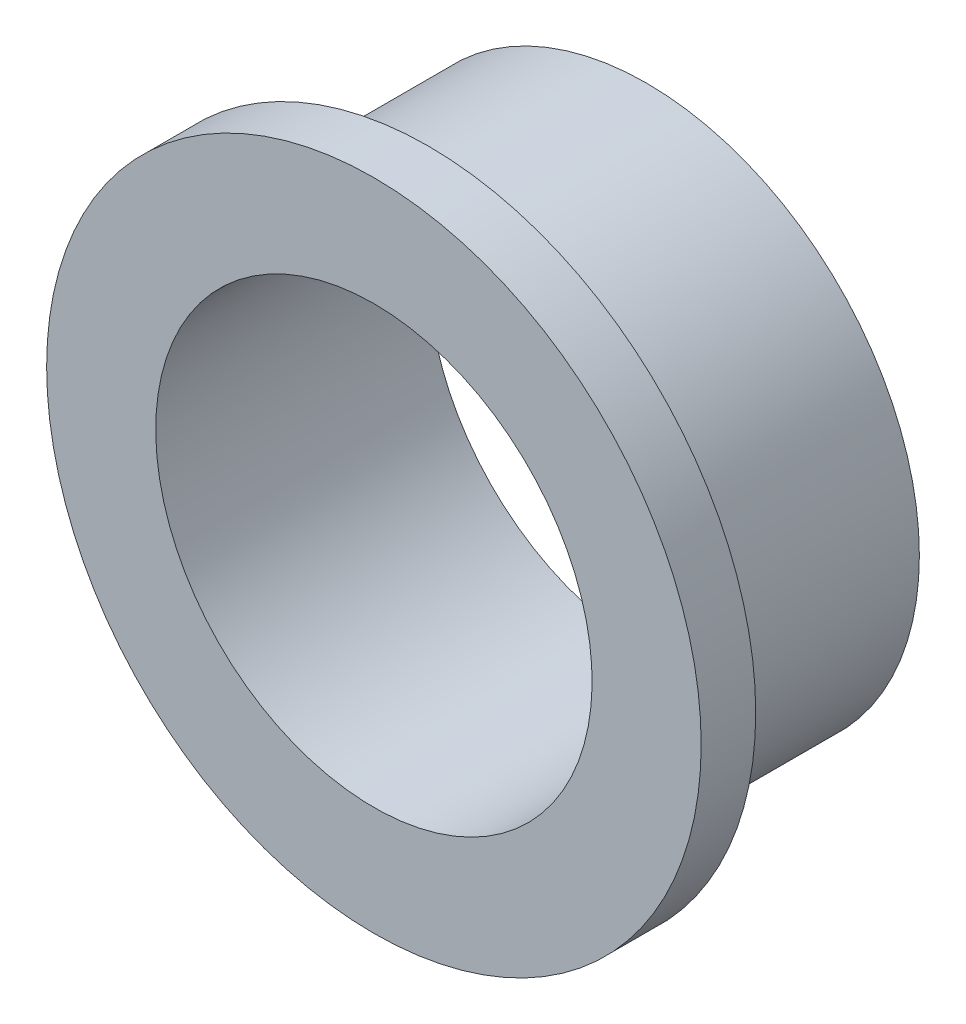
ISO-10303-21;
HEADER;
FILE_DESCRIPTION(('STEP AP214'),'2;1');
FILE_NAME('part.step','',(''),(''),'','','');
FILE_SCHEMA(('AUTOMOTIVE_DESIGN { 1 0 10303 214 1 1 1 1 }'));
ENDSEC;
DATA;
#1=APPLICATION_CONTEXT('core data for automotive mechanical design processes');
#2=APPLICATION_PROTOCOL_DEFINITION('international standard','automotive_design',2000,#1);
#3=PRODUCT_CONTEXT('',#1,'mechanical');
#4=PRODUCT('Part','Part','',(#3));
#5=PRODUCT_RELATED_PRODUCT_CATEGORY('part','',(#4));
#6=PRODUCT_DEFINITION_FORMATION('','',#4);
#7=PRODUCT_DEFINITION_CONTEXT('part definition',#1,'design');
#8=PRODUCT_DEFINITION('design','',#6,#7);
#9=PRODUCT_DEFINITION_SHAPE('','',#8);
#10=(LENGTH_UNIT() NAMED_UNIT(*) SI_UNIT(.MILLI.,.METRE.));
#11=(NAMED_UNIT(*) PLANE_ANGLE_UNIT() SI_UNIT($,.RADIAN.));
#12=(NAMED_UNIT(*) SI_UNIT($,.STERADIAN.) SOLID_ANGLE_UNIT());
#13=UNCERTAINTY_MEASURE_WITH_UNIT(LENGTH_MEASURE(1.E-05),#10,'distance_accuracy_value','');
#14=(GEOMETRIC_REPRESENTATION_CONTEXT(3) GLOBAL_UNCERTAINTY_ASSIGNED_CONTEXT((#13)) GLOBAL_UNIT_ASSIGNED_CONTEXT((#10,
#11,#12)) REPRESENTATION_CONTEXT('',''));
#15=CARTESIAN_POINT('',(0.,0.,0.));
#16=DIRECTION('',(0.,0.,1.));
#17=DIRECTION('',(1.,0.,0.));
#18=AXIS2_PLACEMENT_3D('',#15,#16,#17);
#19=CARTESIAN_POINT('',(0.,0.,9.52499999999999));
#20=DIRECTION('',(0.,0.,-1.));
#21=DIRECTION('',(0.,1.,0.));
#22=AXIS2_PLACEMENT_3D('',#19,#20,#21);
#23=PLANE('',#22);
#24=CARTESIAN_POINT('',(0.,-6.35,9.52499999999999));
#25=DIRECTION('',(0.,0.,-1.));
#26=DIRECTION('',(0.,1.,0.));
#27=AXIS2_PLACEMENT_3D('',#24,#25,#26);
#28=CIRCLE('',#27,19.05);
#29=CARTESIAN_POINT('',(0.,12.7,9.525));
#30=VERTEX_POINT('',#29);
#31=EDGE_CURVE('E10',#30,#30,#28,.T.);
#32=ORIENTED_EDGE('',*,*,#31,.T.);
#33=EDGE_LOOP('',(#32));
#34=FACE_BOUND('',#33,.T.);
#35=CARTESIAN_POINT('',(0.,-6.35,9.52499999999999));
#36=DIRECTION('',(0.,0.,-1.));
#37=DIRECTION('',(0.,1.,0.));
#38=AXIS2_PLACEMENT_3D('',#35,#36,#37);
#39=CIRCLE('',#38,15.875);
#40=CARTESIAN_POINT('',(0.,9.525,9.525));
#41=VERTEX_POINT('',#40);
#42=EDGE_CURVE('E55',#41,#41,#39,.T.);
#43=ORIENTED_EDGE('',*,*,#42,.F.);
#44=EDGE_LOOP('',(#43));
#45=FACE_BOUND('',#44,.T.);
#46=ADVANCED_FACE('F33',(#34,#45),#23,.T.);
#47=CARTESIAN_POINT('',(0.,-6.35,15.3979274611399));
#48=DIRECTION('',(0.,0.,-1.));
#49=DIRECTION('',(0.,1.,0.));
#50=AXIS2_PLACEMENT_3D('',#47,#48,#49);
#51=CYLINDRICAL_SURFACE('',#50,19.05);
#52=ORIENTED_EDGE('',*,*,#31,.F.);
#53=EDGE_LOOP('',(#52));
#54=FACE_BOUND('',#53,.T.);
#55=CARTESIAN_POINT('',(0.,-6.35,12.7));
#56=DIRECTION('',(0.,0.,-1.));
#57=DIRECTION('',(0.,1.,0.));
#58=AXIS2_PLACEMENT_3D('',#55,#56,#57);
#59=CIRCLE('',#58,19.05);
#60=CARTESIAN_POINT('',(0.,12.7,12.7));
#61=VERTEX_POINT('',#60);
#62=EDGE_CURVE('E39',#61,#61,#59,.T.);
#63=ORIENTED_EDGE('',*,*,#62,.T.);
#64=EDGE_LOOP('',(#63));
#65=FACE_BOUND('',#64,.T.);
#66=ADVANCED_FACE('F63',(#54,#65),#51,.T.);
#67=CARTESIAN_POINT('',(0.,0.,12.7));
#68=DIRECTION('',(0.,0.,-1.));
#69=DIRECTION('',(0.,1.,0.));
#70=AXIS2_PLACEMENT_3D('',#67,#68,#69);
#71=PLANE('',#70);
#72=ORIENTED_EDGE('',*,*,#62,.F.);
#73=EDGE_LOOP('',(#72));
#74=FACE_BOUND('',#73,.T.);
#75=CARTESIAN_POINT('',(0.,-6.35,12.7));
#76=DIRECTION('',(0.,0.,-1.));
#77=DIRECTION('',(0.,1.,0.));
#78=AXIS2_PLACEMENT_3D('',#75,#76,#77);
#79=CIRCLE('',#78,12.7);
#80=CARTESIAN_POINT('',(0.,6.35,12.7));
#81=VERTEX_POINT('',#80);
#82=EDGE_CURVE('E43',#81,#81,#79,.T.);
#83=ORIENTED_EDGE('',*,*,#82,.T.);
#84=EDGE_LOOP('',(#83));
#85=FACE_BOUND('',#84,.T.);
#86=ADVANCED_FACE('F67',(#74,#85),#71,.F.);
#87=CARTESIAN_POINT('',(0.,-6.35,15.3979274611399));
#88=DIRECTION('',(0.,0.,-1.));
#89=DIRECTION('',(0.,1.,0.));
#90=AXIS2_PLACEMENT_3D('',#87,#88,#89);
#91=CYLINDRICAL_SURFACE('',#90,12.7);
#92=ORIENTED_EDGE('',*,*,#82,.F.);
#93=EDGE_LOOP('',(#92));
#94=FACE_BOUND('',#93,.T.);
#95=CARTESIAN_POINT('',(0.,-6.35,-3.17500000000001));
#96=DIRECTION('',(0.,0.,-1.));
#97=DIRECTION('',(0.,1.,0.));
#98=AXIS2_PLACEMENT_3D('',#95,#96,#97);
#99=CIRCLE('',#98,12.7);
#100=CARTESIAN_POINT('',(0.,6.35,-3.17500000000001));
#101=VERTEX_POINT('',#100);
#102=EDGE_CURVE('E47',#101,#101,#99,.T.);
#103=ORIENTED_EDGE('',*,*,#102,.T.);
#104=EDGE_LOOP('',(#103));
#105=FACE_BOUND('',#104,.T.);
#106=ADVANCED_FACE('F72',(#94,#105),#91,.F.);
#107=CARTESIAN_POINT('',(0.,0.,-3.17500000000001));
#108=DIRECTION('',(0.,0.,1.));
#109=DIRECTION('',(0.,-1.,0.));
#110=AXIS2_PLACEMENT_3D('',#107,#108,#109);
#111=PLANE('',#110);
#112=ORIENTED_EDGE('',*,*,#102,.F.);
#113=EDGE_LOOP('',(#112));
#114=FACE_BOUND('',#113,.T.);
#115=CARTESIAN_POINT('',(0.,-6.35,-3.17500000000001));
#116=DIRECTION('',(0.,0.,-1.));
#117=DIRECTION('',(0.,1.,0.));
#118=AXIS2_PLACEMENT_3D('',#115,#116,#117);
#119=CIRCLE('',#118,15.875);
#120=CARTESIAN_POINT('',(0.,9.525,-3.17500000000001));
#121=VERTEX_POINT('',#120);
#122=EDGE_CURVE('E52',#121,#121,#119,.T.);
#123=ORIENTED_EDGE('',*,*,#122,.T.);
#124=EDGE_LOOP('',(#123));
#125=FACE_BOUND('',#124,.T.);
#126=ADVANCED_FACE('F78',(#114,#125),#111,.F.);
#127=CARTESIAN_POINT('',(0.,-6.35,15.3979274611399));
#128=DIRECTION('',(0.,0.,-1.));
#129=DIRECTION('',(0.,1.,0.));
#130=AXIS2_PLACEMENT_3D('',#127,#128,#129);
#131=CYLINDRICAL_SURFACE('',#130,15.875);
#132=ORIENTED_EDGE('',*,*,#42,.T.);
#133=EDGE_LOOP('',(#132));
#134=FACE_BOUND('',#133,.T.);
#135=ORIENTED_EDGE('',*,*,#122,.F.);
#136=EDGE_LOOP('',(#135));
#137=FACE_BOUND('',#136,.T.);
#138=ADVANCED_FACE('F59',(#134,#137),#131,.T.);
#139=CLOSED_SHELL('',(#46,#66,#86,#106,#126,#138));
#140=MANIFOLD_SOLID_BREP('B2',#139);
#141=ADVANCED_BREP_SHAPE_REPRESENTATION('',(#18,#140),#14);
#142=SHAPE_DEFINITION_REPRESENTATION(#9,#141);
ENDSEC;
END-ISO-10303-21;
